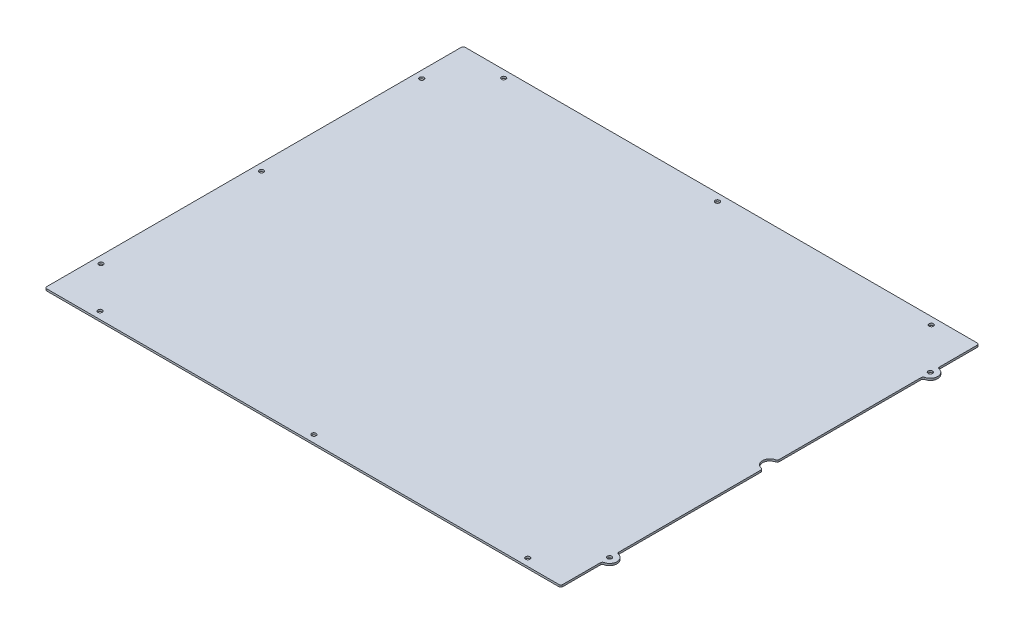
ISO-10303-21;
HEADER;
FILE_DESCRIPTION(('STEP AP214'),'2;1');
FILE_NAME('part.step','',(''),(''),'','','');
FILE_SCHEMA(('AUTOMOTIVE_DESIGN { 1 0 10303 214 1 1 1 1 }'));
ENDSEC;
DATA;
#1=APPLICATION_CONTEXT('core data for automotive mechanical design processes');
#2=APPLICATION_PROTOCOL_DEFINITION('international standard','automotive_design',2000,#1);
#3=PRODUCT_CONTEXT('',#1,'mechanical');
#4=PRODUCT('Part','Part','',(#3));
#5=PRODUCT_RELATED_PRODUCT_CATEGORY('part','',(#4));
#6=PRODUCT_DEFINITION_FORMATION('','',#4);
#7=PRODUCT_DEFINITION_CONTEXT('part definition',#1,'design');
#8=PRODUCT_DEFINITION('design','',#6,#7);
#9=PRODUCT_DEFINITION_SHAPE('','',#8);
#10=(LENGTH_UNIT() NAMED_UNIT(*) SI_UNIT(.MILLI.,.METRE.));
#11=(NAMED_UNIT(*) PLANE_ANGLE_UNIT() SI_UNIT($,.RADIAN.));
#12=(NAMED_UNIT(*) SI_UNIT($,.STERADIAN.) SOLID_ANGLE_UNIT());
#13=UNCERTAINTY_MEASURE_WITH_UNIT(LENGTH_MEASURE(1.E-05),#10,'distance_accuracy_value','');
#14=(GEOMETRIC_REPRESENTATION_CONTEXT(3) GLOBAL_UNCERTAINTY_ASSIGNED_CONTEXT((#13)) GLOBAL_UNIT_ASSIGNED_CONTEXT((#10,
#11,#12)) REPRESENTATION_CONTEXT('',''));
#15=CARTESIAN_POINT('',(0.,0.,0.));
#16=DIRECTION('',(0.,0.,1.));
#17=DIRECTION('',(1.,0.,0.));
#18=AXIS2_PLACEMENT_3D('',#15,#16,#17);
#19=CARTESIAN_POINT('',(-341.884,2.54,273.304));
#20=DIRECTION('',(1.,0.,0.));
#21=DIRECTION('',(0.,0.,-1.));
#22=AXIS2_PLACEMENT_3D('',#19,#20,#21);
#23=PLANE('',#22);
#24=DIRECTION('',(0.,0.,1.));
#25=VECTOR('',#24,1.);
#26=CARTESIAN_POINT('',(-341.884,2.54,273.304));
#27=LINE('',#26,#25);
#28=CARTESIAN_POINT('',(-341.884,2.54,-270.764));
#29=VERTEX_POINT('',#28);
#30=CARTESIAN_POINT('',(-341.884,2.54,270.764));
#31=VERTEX_POINT('',#30);
#32=EDGE_CURVE('E189',#29,#31,#27,.T.);
#33=ORIENTED_EDGE('',*,*,#32,.F.);
#34=DIRECTION('',(0.,-1.,0.));
#35=VECTOR('',#34,1.);
#36=CARTESIAN_POINT('',(-341.884,2.54,-270.764));
#37=LINE('',#36,#35);
#38=CARTESIAN_POINT('',(-341.884,0.,-270.764));
#39=VERTEX_POINT('',#38);
#40=EDGE_CURVE('E174',#29,#39,#37,.T.);
#41=ORIENTED_EDGE('',*,*,#40,.T.);
#42=DIRECTION('',(0.,0.,1.));
#43=VECTOR('',#42,1.);
#44=CARTESIAN_POINT('',(-341.884,0.,273.304));
#45=LINE('',#44,#43);
#46=CARTESIAN_POINT('',(-341.884,0.,270.764));
#47=VERTEX_POINT('',#46);
#48=EDGE_CURVE('E186',#39,#47,#45,.T.);
#49=ORIENTED_EDGE('',*,*,#48,.T.);
#50=DIRECTION('',(0.,-1.,0.));
#51=VECTOR('',#50,1.);
#52=CARTESIAN_POINT('',(-341.884,2.54,270.764));
#53=LINE('',#52,#51);
#54=EDGE_CURVE('E191',#47,#31,#53,.F.);
#55=ORIENTED_EDGE('',*,*,#54,.T.);
#56=EDGE_LOOP('',(#33,#41,#49,#55));
#57=FACE_BOUND('',#56,.T.);
#58=ADVANCED_FACE('F33',(#57),#23,.F.);
#59=CARTESIAN_POINT('',(-341.884,2.54,273.304));
#60=DIRECTION('',(0.,0.,-1.));
#61=DIRECTION('',(-1.,0.,0.));
#62=AXIS2_PLACEMENT_3D('',#59,#60,#61);
#63=PLANE('',#62);
#64=DIRECTION('',(1.,0.,0.));
#65=VECTOR('',#64,1.);
#66=CARTESIAN_POINT('',(-341.884,2.54,273.304));
#67=LINE('',#66,#65);
#68=CARTESIAN_POINT('',(-339.344,2.54,273.304));
#69=VERTEX_POINT('',#68);
#70=CARTESIAN_POINT('',(329.692,2.54,273.304));
#71=VERTEX_POINT('',#70);
#72=EDGE_CURVE('E335',#69,#71,#67,.T.);
#73=ORIENTED_EDGE('',*,*,#72,.F.);
#74=DIRECTION('',(0.,-1.,0.));
#75=VECTOR('',#74,1.);
#76=CARTESIAN_POINT('',(-339.344,2.54,273.304));
#77=LINE('',#76,#75);
#78=CARTESIAN_POINT('',(-339.344,0.,273.304));
#79=VERTEX_POINT('',#78);
#80=EDGE_CURVE('E255',#69,#79,#77,.T.);
#81=ORIENTED_EDGE('',*,*,#80,.T.);
#82=DIRECTION('',(1.,0.,0.));
#83=VECTOR('',#82,1.);
#84=CARTESIAN_POINT('',(-341.884,0.,273.304));
#85=LINE('',#84,#83);
#86=CARTESIAN_POINT('',(329.692,0.,273.304));
#87=VERTEX_POINT('',#86);
#88=EDGE_CURVE('E195',#79,#87,#85,.T.);
#89=ORIENTED_EDGE('',*,*,#88,.T.);
#90=DIRECTION('',(0.,-1.,0.));
#91=VECTOR('',#90,1.);
#92=CARTESIAN_POINT('',(329.692,2.54,273.304));
#93=LINE('',#92,#91);
#94=EDGE_CURVE('E253',#87,#71,#93,.F.);
#95=ORIENTED_EDGE('',*,*,#94,.T.);
#96=EDGE_LOOP('',(#73,#81,#89,#95));
#97=FACE_BOUND('',#96,.T.);
#98=ADVANCED_FACE('F454',(#97),#63,.F.);
#99=CARTESIAN_POINT('',(332.232,2.54,219.202));
#100=DIRECTION('',(-1.,0.,0.));
#101=DIRECTION('',(0.,0.,1.));
#102=AXIS2_PLACEMENT_3D('',#99,#100,#101);
#103=PLANE('',#102);
#104=DIRECTION('',(0.,0.,-1.));
#105=VECTOR('',#104,1.);
#106=CARTESIAN_POINT('',(332.232,2.54,219.202));
#107=LINE('',#106,#105);
#108=CARTESIAN_POINT('',(332.232,2.54,270.764));
#109=VERTEX_POINT('',#108);
#110=CARTESIAN_POINT('',(332.232,2.54,221.474481707814));
#111=VERTEX_POINT('',#110);
#112=EDGE_CURVE('E332',#109,#111,#107,.T.);
#113=ORIENTED_EDGE('',*,*,#112,.F.);
#114=DIRECTION('',(0.,-1.,0.));
#115=VECTOR('',#114,1.);
#116=CARTESIAN_POINT('',(332.232,2.54,270.764));
#117=LINE('',#116,#115);
#118=CARTESIAN_POINT('',(332.232,0.,270.764));
#119=VERTEX_POINT('',#118);
#120=EDGE_CURVE('E260',#109,#119,#117,.T.);
#121=ORIENTED_EDGE('',*,*,#120,.T.);
#122=DIRECTION('',(0.,0.,-1.));
#123=VECTOR('',#122,1.);
#124=CARTESIAN_POINT('',(332.232,0.,219.202));
#125=LINE('',#124,#123);
#126=CARTESIAN_POINT('',(332.232,0.,221.474481707814));
#127=VERTEX_POINT('',#126);
#128=EDGE_CURVE('E199',#119,#127,#125,.T.);
#129=ORIENTED_EDGE('',*,*,#128,.T.);
#130=DIRECTION('',(0.,1.,0.));
#131=VECTOR('',#130,1.);
#132=CARTESIAN_POINT('',(332.232,2.54,221.474481707814));
#133=LINE('',#132,#131);
#134=EDGE_CURVE('E258',#127,#111,#133,.T.);
#135=ORIENTED_EDGE('',*,*,#134,.T.);
#136=EDGE_LOOP('',(#113,#121,#129,#135));
#137=FACE_BOUND('',#136,.T.);
#138=ADVANCED_FACE('F459',(#137),#103,.F.);
#139=CARTESIAN_POINT('',(332.232,2.54,209.55));
#140=DIRECTION('',(0.,-1.,0.));
#141=DIRECTION('',(0.,0.,-1.));
#142=AXIS2_PLACEMENT_3D('',#139,#140,#141);
#143=CYLINDRICAL_SURFACE('',#142,9.65199999999997);
#144=CARTESIAN_POINT('',(332.232,2.54,209.55));
#145=DIRECTION('',(0.,1.,0.));
#146=DIRECTION('',(0.,0.,1.));
#147=AXIS2_PLACEMENT_3D('',#144,#145,#146);
#148=CIRCLE('',#147,9.65199999999997);
#149=CARTESIAN_POINT('',(334.242833333333,2.54,218.990214685353));
#150=VERTEX_POINT('',#149);
#151=CARTESIAN_POINT('',(334.242833333333,2.54,200.109785314647));
#152=VERTEX_POINT('',#151);
#153=EDGE_CURVE('E329',#150,#152,#148,.T.);
#154=ORIENTED_EDGE('',*,*,#153,.F.);
#155=DIRECTION('',(0.,-1.,0.));
#156=VECTOR('',#155,1.);
#157=CARTESIAN_POINT('',(334.242833333333,2.54,218.990214685353));
#158=LINE('',#157,#156);
#159=CARTESIAN_POINT('',(334.242833333333,0.,218.990214685353));
#160=VERTEX_POINT('',#159);
#161=EDGE_CURVE('E265',#150,#160,#158,.T.);
#162=ORIENTED_EDGE('',*,*,#161,.T.);
#163=CARTESIAN_POINT('',(332.232,0.,209.55));
#164=DIRECTION('',(0.,1.,0.));
#165=DIRECTION('',(0.,0.,1.));
#166=AXIS2_PLACEMENT_3D('',#163,#164,#165);
#167=CIRCLE('',#166,9.65199999999997);
#168=CARTESIAN_POINT('',(334.242833333333,0.,200.109785314647));
#169=VERTEX_POINT('',#168);
#170=EDGE_CURVE('E210',#160,#169,#167,.T.);
#171=ORIENTED_EDGE('',*,*,#170,.T.);
#172=DIRECTION('',(0.,-1.,0.));
#173=VECTOR('',#172,1.);
#174=CARTESIAN_POINT('',(334.242833333333,2.54,200.109785314647));
#175=LINE('',#174,#173);
#176=EDGE_CURVE('E263',#169,#152,#175,.F.);
#177=ORIENTED_EDGE('',*,*,#176,.T.);
#178=EDGE_LOOP('',(#154,#162,#171,#177));
#179=FACE_BOUND('',#178,.T.);
#180=ADVANCED_FACE('F520',(#179),#143,.T.);
#181=CARTESIAN_POINT('',(332.232,2.54,9.65199999999998));
#182=DIRECTION('',(-1.,0.,0.));
#183=DIRECTION('',(0.,0.,1.));
#184=AXIS2_PLACEMENT_3D('',#181,#182,#183);
#185=PLANE('',#184);
#186=DIRECTION('',(0.,0.,-1.));
#187=VECTOR('',#186,1.);
#188=CARTESIAN_POINT('',(332.232,2.54,9.65199999999998));
#189=LINE('',#188,#187);
#190=CARTESIAN_POINT('',(332.232,2.54,197.625518292186));
#191=VERTEX_POINT('',#190);
#192=CARTESIAN_POINT('',(332.232,2.54,11.9244817078144));
#193=VERTEX_POINT('',#192);
#194=EDGE_CURVE('E326',#191,#193,#189,.T.);
#195=ORIENTED_EDGE('',*,*,#194,.F.);
#196=DIRECTION('',(0.,1.,0.));
#197=VECTOR('',#196,1.);
#198=CARTESIAN_POINT('',(332.232,0.,197.625518292186));
#199=LINE('',#198,#197);
#200=CARTESIAN_POINT('',(332.232,0.,197.625518292186));
#201=VERTEX_POINT('',#200);
#202=EDGE_CURVE('E270',#191,#201,#199,.F.);
#203=ORIENTED_EDGE('',*,*,#202,.T.);
#204=DIRECTION('',(0.,0.,-1.));
#205=VECTOR('',#204,1.);
#206=CARTESIAN_POINT('',(332.232,0.,9.65199999999998));
#207=LINE('',#206,#205);
#208=CARTESIAN_POINT('',(332.232,0.,11.9244817078144));
#209=VERTEX_POINT('',#208);
#210=EDGE_CURVE('E213',#201,#209,#207,.T.);
#211=ORIENTED_EDGE('',*,*,#210,.T.);
#212=DIRECTION('',(0.,-1.,0.));
#213=VECTOR('',#212,1.);
#214=CARTESIAN_POINT('',(332.232,2.54,11.9244817078144));
#215=LINE('',#214,#213);
#216=EDGE_CURVE('E268',#209,#193,#215,.F.);
#217=ORIENTED_EDGE('',*,*,#216,.T.);
#218=EDGE_LOOP('',(#195,#203,#211,#217));
#219=FACE_BOUND('',#218,.T.);
#220=ADVANCED_FACE('F513',(#219),#185,.F.);
#221=CARTESIAN_POINT('',(332.232,2.54,0.));
#222=DIRECTION('',(0.,-1.,0.));
#223=DIRECTION('',(0.,0.,-1.));
#224=AXIS2_PLACEMENT_3D('',#221,#222,#223);
#225=CYLINDRICAL_SURFACE('',#224,9.65199999999998);
#226=CARTESIAN_POINT('',(332.232,2.54,0.));
#227=DIRECTION('',(0.,-1.,0.));
#228=DIRECTION('',(0.,0.,1.));
#229=AXIS2_PLACEMENT_3D('',#226,#227,#228);
#230=CIRCLE('',#229,9.65199999999998);
#231=CARTESIAN_POINT('',(330.221166666667,2.54,9.44021468535305));
#232=VERTEX_POINT('',#231);
#233=CARTESIAN_POINT('',(330.221166666667,2.54,-9.44021468535305));
#234=VERTEX_POINT('',#233);
#235=EDGE_CURVE('E323',#232,#234,#230,.T.);
#236=ORIENTED_EDGE('',*,*,#235,.F.);
#237=DIRECTION('',(0.,-1.,0.));
#238=VECTOR('',#237,1.);
#239=CARTESIAN_POINT('',(330.221166666667,2.54,9.44021468535305));
#240=LINE('',#239,#238);
#241=CARTESIAN_POINT('',(330.221166666667,0.,9.44021468535305));
#242=VERTEX_POINT('',#241);
#243=EDGE_CURVE('E275',#232,#242,#240,.T.);
#244=ORIENTED_EDGE('',*,*,#243,.T.);
#245=CARTESIAN_POINT('',(332.232,0.,0.));
#246=DIRECTION('',(0.,-1.,0.));
#247=DIRECTION('',(0.,0.,1.));
#248=AXIS2_PLACEMENT_3D('',#245,#246,#247);
#249=CIRCLE('',#248,9.65199999999998);
#250=CARTESIAN_POINT('',(330.221166666667,0.,-9.44021468535305));
#251=VERTEX_POINT('',#250);
#252=EDGE_CURVE('E216',#242,#251,#249,.T.);
#253=ORIENTED_EDGE('',*,*,#252,.T.);
#254=DIRECTION('',(0.,-1.,0.));
#255=VECTOR('',#254,1.);
#256=CARTESIAN_POINT('',(330.221166666667,2.54,-9.44021468535305));
#257=LINE('',#256,#255);
#258=EDGE_CURVE('E273',#251,#234,#257,.F.);
#259=ORIENTED_EDGE('',*,*,#258,.T.);
#260=EDGE_LOOP('',(#236,#244,#253,#259));
#261=FACE_BOUND('',#260,.T.);
#262=ADVANCED_FACE('F506',(#261),#225,.F.);
#263=CARTESIAN_POINT('',(332.232,2.54,-199.898));
#264=DIRECTION('',(-1.,0.,0.));
#265=DIRECTION('',(0.,0.,1.));
#266=AXIS2_PLACEMENT_3D('',#263,#264,#265);
#267=PLANE('',#266);
#268=DIRECTION('',(0.,0.,-1.));
#269=VECTOR('',#268,1.);
#270=CARTESIAN_POINT('',(332.232,2.54,-199.898));
#271=LINE('',#270,#269);
#272=CARTESIAN_POINT('',(332.232,2.54,-11.9244817078144));
#273=VERTEX_POINT('',#272);
#274=CARTESIAN_POINT('',(332.232,2.54,-197.625518292186));
#275=VERTEX_POINT('',#274);
#276=EDGE_CURVE('E318',#273,#275,#271,.T.);
#277=ORIENTED_EDGE('',*,*,#276,.F.);
#278=DIRECTION('',(0.,-1.,0.));
#279=VECTOR('',#278,1.);
#280=CARTESIAN_POINT('',(332.232,2.54,-11.9244817078144));
#281=LINE('',#280,#279);
#282=CARTESIAN_POINT('',(332.232,0.,-11.9244817078144));
#283=VERTEX_POINT('',#282);
#284=EDGE_CURVE('E280',#273,#283,#281,.T.);
#285=ORIENTED_EDGE('',*,*,#284,.T.);
#286=DIRECTION('',(0.,0.,-1.));
#287=VECTOR('',#286,1.);
#288=CARTESIAN_POINT('',(332.232,0.,-199.898));
#289=LINE('',#288,#287);
#290=CARTESIAN_POINT('',(332.232,0.,-197.625518292186));
#291=VERTEX_POINT('',#290);
#292=EDGE_CURVE('E219',#283,#291,#289,.T.);
#293=ORIENTED_EDGE('',*,*,#292,.T.);
#294=DIRECTION('',(0.,1.,0.));
#295=VECTOR('',#294,1.);
#296=CARTESIAN_POINT('',(332.232,2.54,-197.625518292186));
#297=LINE('',#296,#295);
#298=EDGE_CURVE('E278',#291,#275,#297,.T.);
#299=ORIENTED_EDGE('',*,*,#298,.T.);
#300=EDGE_LOOP('',(#277,#285,#293,#299));
#301=FACE_BOUND('',#300,.T.);
#302=ADVANCED_FACE('F500',(#301),#267,.F.);
#303=CARTESIAN_POINT('',(332.232,2.54,-209.55));
#304=DIRECTION('',(0.,-1.,0.));
#305=DIRECTION('',(0.,0.,-1.));
#306=AXIS2_PLACEMENT_3D('',#303,#304,#305);
#307=CYLINDRICAL_SURFACE('',#306,9.65199999999997);
#308=CARTESIAN_POINT('',(332.232,2.54,-209.55));
#309=DIRECTION('',(0.,1.,0.));
#310=DIRECTION('',(0.,0.,1.));
#311=AXIS2_PLACEMENT_3D('',#308,#309,#310);
#312=CIRCLE('',#311,9.65199999999997);
#313=CARTESIAN_POINT('',(334.242833333333,2.54,-200.109785314647));
#314=VERTEX_POINT('',#313);
#315=CARTESIAN_POINT('',(334.242833333333,2.54,-218.990214685353));
#316=VERTEX_POINT('',#315);
#317=EDGE_CURVE('E316',#314,#316,#312,.T.);
#318=ORIENTED_EDGE('',*,*,#317,.F.);
#319=DIRECTION('',(0.,-1.,0.));
#320=VECTOR('',#319,1.);
#321=CARTESIAN_POINT('',(334.242833333333,2.54,-200.109785314647));
#322=LINE('',#321,#320);
#323=CARTESIAN_POINT('',(334.242833333333,0.,-200.109785314647));
#324=VERTEX_POINT('',#323);
#325=EDGE_CURVE('E285',#314,#324,#322,.T.);
#326=ORIENTED_EDGE('',*,*,#325,.T.);
#327=CARTESIAN_POINT('',(332.232,0.,-209.55));
#328=DIRECTION('',(0.,1.,0.));
#329=DIRECTION('',(0.,0.,1.));
#330=AXIS2_PLACEMENT_3D('',#327,#328,#329);
#331=CIRCLE('',#330,9.65199999999997);
#332=CARTESIAN_POINT('',(334.242833333333,0.,-218.990214685353));
#333=VERTEX_POINT('',#332);
#334=EDGE_CURVE('E222',#324,#333,#331,.T.);
#335=ORIENTED_EDGE('',*,*,#334,.T.);
#336=DIRECTION('',(0.,-1.,0.));
#337=VECTOR('',#336,1.);
#338=CARTESIAN_POINT('',(334.242833333333,2.54,-218.990214685353));
#339=LINE('',#338,#337);
#340=EDGE_CURVE('E283',#333,#316,#339,.F.);
#341=ORIENTED_EDGE('',*,*,#340,.T.);
#342=EDGE_LOOP('',(#318,#326,#335,#341));
#343=FACE_BOUND('',#342,.T.);
#344=ADVANCED_FACE('F310',(#343),#307,.T.);
#345=CARTESIAN_POINT('',(332.232,2.54,-273.304));
#346=DIRECTION('',(-1.,0.,0.));
#347=DIRECTION('',(0.,0.,1.));
#348=AXIS2_PLACEMENT_3D('',#345,#346,#347);
#349=PLANE('',#348);
#350=DIRECTION('',(0.,0.,-1.));
#351=VECTOR('',#350,1.);
#352=CARTESIAN_POINT('',(332.232,2.54,-273.304));
#353=LINE('',#352,#351);
#354=CARTESIAN_POINT('',(332.232,2.54,-221.474481707814));
#355=VERTEX_POINT('',#354);
#356=CARTESIAN_POINT('',(332.232,2.54,-270.764));
#357=VERTEX_POINT('',#356);
#358=EDGE_CURVE('E314',#355,#357,#353,.T.);
#359=ORIENTED_EDGE('',*,*,#358,.F.);
#360=DIRECTION('',(0.,1.,0.));
#361=VECTOR('',#360,1.);
#362=CARTESIAN_POINT('',(332.232,0.,-221.474481707814));
#363=LINE('',#362,#361);
#364=CARTESIAN_POINT('',(332.232,0.,-221.474481707814));
#365=VERTEX_POINT('',#364);
#366=EDGE_CURVE('E289',#355,#365,#363,.F.);
#367=ORIENTED_EDGE('',*,*,#366,.T.);
#368=DIRECTION('',(0.,0.,-1.));
#369=VECTOR('',#368,1.);
#370=CARTESIAN_POINT('',(332.232,0.,-273.304));
#371=LINE('',#370,#369);
#372=CARTESIAN_POINT('',(332.232,0.,-270.764));
#373=VERTEX_POINT('',#372);
#374=EDGE_CURVE('E225',#365,#373,#371,.T.);
#375=ORIENTED_EDGE('',*,*,#374,.T.);
#376=DIRECTION('',(0.,-1.,0.));
#377=VECTOR('',#376,1.);
#378=CARTESIAN_POINT('',(332.232,2.54,-270.764));
#379=LINE('',#378,#377);
#380=EDGE_CURVE('E48',#373,#357,#379,.F.);
#381=ORIENTED_EDGE('',*,*,#380,.T.);
#382=EDGE_LOOP('',(#359,#367,#375,#381));
#383=FACE_BOUND('',#382,.T.);
#384=ADVANCED_FACE('F313',(#383),#349,.F.);
#385=CARTESIAN_POINT('',(-341.884,2.54,-273.304));
#386=DIRECTION('',(0.,0.,1.));
#387=DIRECTION('',(1.,0.,0.));
#388=AXIS2_PLACEMENT_3D('',#385,#386,#387);
#389=PLANE('',#388);
#390=DIRECTION('',(-1.,0.,0.));
#391=VECTOR('',#390,1.);
#392=CARTESIAN_POINT('',(-341.884,0.,-273.304));
#393=LINE('',#392,#391);
#394=CARTESIAN_POINT('',(329.692,0.,-273.304));
#395=VERTEX_POINT('',#394);
#396=CARTESIAN_POINT('',(-339.344,0.,-273.304));
#397=VERTEX_POINT('',#396);
#398=EDGE_CURVE('E227',#395,#397,#393,.T.);
#399=ORIENTED_EDGE('',*,*,#398,.T.);
#400=DIRECTION('',(0.,-1.,0.));
#401=VECTOR('',#400,1.);
#402=CARTESIAN_POINT('',(-339.344,2.54,-273.304));
#403=LINE('',#402,#401);
#404=CARTESIAN_POINT('',(-339.344,2.54,-273.304));
#405=VERTEX_POINT('',#404);
#406=EDGE_CURVE('E175',#397,#405,#403,.F.);
#407=ORIENTED_EDGE('',*,*,#406,.T.);
#408=DIRECTION('',(-1.,0.,0.));
#409=VECTOR('',#408,1.);
#410=CARTESIAN_POINT('',(-341.884,2.54,-273.304));
#411=LINE('',#410,#409);
#412=CARTESIAN_POINT('',(329.692,2.54,-273.304));
#413=VERTEX_POINT('',#412);
#414=EDGE_CURVE('E205',#413,#405,#411,.T.);
#415=ORIENTED_EDGE('',*,*,#414,.F.);
#416=DIRECTION('',(0.,-1.,0.));
#417=VECTOR('',#416,1.);
#418=CARTESIAN_POINT('',(329.692,2.54,-273.304));
#419=LINE('',#418,#417);
#420=EDGE_CURVE('E180',#413,#395,#419,.T.);
#421=ORIENTED_EDGE('',*,*,#420,.T.);
#422=EDGE_LOOP('',(#399,#407,#415,#421));
#423=FACE_BOUND('',#422,.T.);
#424=ADVANCED_FACE('F436',(#423),#389,.F.);
#425=CARTESIAN_POINT('',(332.232,2.54,-209.55));
#426=DIRECTION('',(0.,1.,0.));
#427=DIRECTION('',(0.,0.,1.));
#428=AXIS2_PLACEMENT_3D('',#425,#426,#427);
#429=PLANE('',#428);
#430=CARTESIAN_POINT('',(279.4,2.54,-263.652));
#431=DIRECTION('',(0.,-1.,0.));
#432=DIRECTION('',(0.,0.,-1.));
#433=AXIS2_PLACEMENT_3D('',#430,#431,#432);
#434=CIRCLE('',#433,2.8956);
#435=CARTESIAN_POINT('',(279.4,2.54,-266.5476));
#436=VERTEX_POINT('',#435);
#437=EDGE_CURVE('E395',#436,#436,#434,.T.);
#438=ORIENTED_EDGE('',*,*,#437,.T.);
#439=EDGE_LOOP('',(#438));
#440=FACE_BOUND('',#439,.T.);
#441=CARTESIAN_POINT('',(1.11022302462516E-13,2.54,-263.652));
#442=DIRECTION('',(0.,-1.,0.));
#443=DIRECTION('',(0.,0.,-1.));
#444=AXIS2_PLACEMENT_3D('',#441,#442,#443);
#445=CIRCLE('',#444,2.8956);
#446=CARTESIAN_POINT('',(1.11022302462516E-13,2.54,-266.5476));
#447=VERTEX_POINT('',#446);
#448=EDGE_CURVE('E389',#447,#447,#445,.T.);
#449=ORIENTED_EDGE('',*,*,#448,.T.);
#450=EDGE_LOOP('',(#449));
#451=FACE_BOUND('',#450,.T.);
#452=CARTESIAN_POINT('',(-279.4,2.54,-263.652));
#453=DIRECTION('',(0.,-1.,0.));
#454=DIRECTION('',(0.,0.,-1.));
#455=AXIS2_PLACEMENT_3D('',#452,#453,#454);
#456=CIRCLE('',#455,2.8956);
#457=CARTESIAN_POINT('',(-279.4,2.54,-266.5476));
#458=VERTEX_POINT('',#457);
#459=EDGE_CURVE('E383',#458,#458,#456,.T.);
#460=ORIENTED_EDGE('',*,*,#459,.T.);
#461=EDGE_LOOP('',(#460));
#462=FACE_BOUND('',#461,.T.);
#463=CARTESIAN_POINT('',(-332.232,2.54,-209.55));
#464=DIRECTION('',(0.,-1.,0.));
#465=DIRECTION('',(0.,0.,-1.));
#466=AXIS2_PLACEMENT_3D('',#463,#464,#465);
#467=CIRCLE('',#466,2.8956);
#468=CARTESIAN_POINT('',(-332.232,2.54,-212.4456));
#469=VERTEX_POINT('',#468);
#470=EDGE_CURVE('E377',#469,#469,#467,.T.);
#471=ORIENTED_EDGE('',*,*,#470,.T.);
#472=EDGE_LOOP('',(#471));
#473=FACE_BOUND('',#472,.T.);
#474=CARTESIAN_POINT('',(-332.232,2.54,1.11022302462516E-13));
#475=DIRECTION('',(0.,-1.,0.));
#476=DIRECTION('',(0.,0.,-1.));
#477=AXIS2_PLACEMENT_3D('',#474,#475,#476);
#478=CIRCLE('',#477,2.8956);
#479=CARTESIAN_POINT('',(-332.232,2.54,-2.89559999999989));
#480=VERTEX_POINT('',#479);
#481=EDGE_CURVE('E371',#480,#480,#478,.T.);
#482=ORIENTED_EDGE('',*,*,#481,.T.);
#483=EDGE_LOOP('',(#482));
#484=FACE_BOUND('',#483,.T.);
#485=CARTESIAN_POINT('',(-332.232,2.54,209.55));
#486=DIRECTION('',(0.,-1.,0.));
#487=DIRECTION('',(0.,0.,-1.));
#488=AXIS2_PLACEMENT_3D('',#485,#486,#487);
#489=CIRCLE('',#488,2.8956);
#490=CARTESIAN_POINT('',(-332.232,2.54,206.6544));
#491=VERTEX_POINT('',#490);
#492=EDGE_CURVE('E365',#491,#491,#489,.T.);
#493=ORIENTED_EDGE('',*,*,#492,.T.);
#494=EDGE_LOOP('',(#493));
#495=FACE_BOUND('',#494,.T.);
#496=CARTESIAN_POINT('',(-279.4,2.54,263.652));
#497=DIRECTION('',(0.,-1.,0.));
#498=DIRECTION('',(0.,0.,-1.));
#499=AXIS2_PLACEMENT_3D('',#496,#497,#498);
#500=CIRCLE('',#499,2.8956);
#501=CARTESIAN_POINT('',(-279.4,2.54,260.7564));
#502=VERTEX_POINT('',#501);
#503=EDGE_CURVE('E359',#502,#502,#500,.T.);
#504=ORIENTED_EDGE('',*,*,#503,.T.);
#505=EDGE_LOOP('',(#504));
#506=FACE_BOUND('',#505,.T.);
#507=CARTESIAN_POINT('',(1.11022302462516E-13,2.54,263.652));
#508=DIRECTION('',(0.,-1.,0.));
#509=DIRECTION('',(0.,0.,-1.));
#510=AXIS2_PLACEMENT_3D('',#507,#508,#509);
#511=CIRCLE('',#510,2.8956);
#512=CARTESIAN_POINT('',(1.11022302462516E-13,2.54,260.7564));
#513=VERTEX_POINT('',#512);
#514=EDGE_CURVE('E353',#513,#513,#511,.T.);
#515=ORIENTED_EDGE('',*,*,#514,.T.);
#516=EDGE_LOOP('',(#515));
#517=FACE_BOUND('',#516,.T.);
#518=CARTESIAN_POINT('',(279.4,2.54,263.652));
#519=DIRECTION('',(0.,-1.,0.));
#520=DIRECTION('',(0.,0.,-1.));
#521=AXIS2_PLACEMENT_3D('',#518,#519,#520);
#522=CIRCLE('',#521,2.8956);
#523=CARTESIAN_POINT('',(279.4,2.54,260.7564));
#524=VERTEX_POINT('',#523);
#525=EDGE_CURVE('E347',#524,#524,#522,.T.);
#526=ORIENTED_EDGE('',*,*,#525,.T.);
#527=EDGE_LOOP('',(#526));
#528=FACE_BOUND('',#527,.T.);
#529=CARTESIAN_POINT('',(332.232,2.54,-209.55));
#530=DIRECTION('',(0.,1.,0.));
#531=DIRECTION('',(0.,0.,1.));
#532=AXIS2_PLACEMENT_3D('',#529,#530,#531);
#533=CIRCLE('',#532,2.8956);
#534=CARTESIAN_POINT('',(332.232,2.54,-206.6544));
#535=VERTEX_POINT('',#534);
#536=EDGE_CURVE('E344',#535,#535,#533,.T.);
#537=ORIENTED_EDGE('',*,*,#536,.F.);
#538=EDGE_LOOP('',(#537));
#539=FACE_BOUND('',#538,.T.);
#540=CARTESIAN_POINT('',(332.232,2.54,209.55));
#541=DIRECTION('',(0.,1.,0.));
#542=DIRECTION('',(0.,0.,1.));
#543=AXIS2_PLACEMENT_3D('',#540,#541,#542);
#544=CIRCLE('',#543,2.8956);
#545=CARTESIAN_POINT('',(332.232,2.54,212.4456));
#546=VERTEX_POINT('',#545);
#547=EDGE_CURVE('E202',#546,#546,#544,.T.);
#548=ORIENTED_EDGE('',*,*,#547,.F.);
#549=EDGE_LOOP('',(#548));
#550=FACE_BOUND('',#549,.T.);
#551=ORIENTED_EDGE('',*,*,#414,.T.);
#552=CARTESIAN_POINT('',(-339.344,2.54,-270.764));
#553=DIRECTION('',(0.,1.,0.));
#554=DIRECTION('',(0.,0.,1.));
#555=AXIS2_PLACEMENT_3D('',#552,#553,#554);
#556=CIRCLE('',#555,2.54);
#557=EDGE_CURVE('E251',#405,#29,#556,.T.);
#558=ORIENTED_EDGE('',*,*,#557,.T.);
#559=ORIENTED_EDGE('',*,*,#32,.T.);
#560=CARTESIAN_POINT('',(-339.344,2.54,270.764));
#561=DIRECTION('',(0.,1.,0.));
#562=DIRECTION('',(0.,0.,1.));
#563=AXIS2_PLACEMENT_3D('',#560,#561,#562);
#564=CIRCLE('',#563,2.54);
#565=EDGE_CURVE('E249',#31,#69,#564,.T.);
#566=ORIENTED_EDGE('',*,*,#565,.T.);
#567=ORIENTED_EDGE('',*,*,#72,.T.);
#568=CARTESIAN_POINT('',(329.692,2.54,270.764));
#569=DIRECTION('',(0.,1.,0.));
#570=DIRECTION('',(0.,0.,1.));
#571=AXIS2_PLACEMENT_3D('',#568,#569,#570);
#572=CIRCLE('',#571,2.54);
#573=EDGE_CURVE('E247',#71,#109,#572,.T.);
#574=ORIENTED_EDGE('',*,*,#573,.T.);
#575=ORIENTED_EDGE('',*,*,#112,.T.);
#576=CARTESIAN_POINT('',(334.772,2.54,221.474481707814));
#577=DIRECTION('',(0.,1.,0.));
#578=DIRECTION('',(0.,0.,1.));
#579=AXIS2_PLACEMENT_3D('',#576,#577,#578);
#580=CIRCLE('',#579,2.54);
#581=EDGE_CURVE('E294',#111,#150,#580,.F.);
#582=ORIENTED_EDGE('',*,*,#581,.T.);
#583=ORIENTED_EDGE('',*,*,#153,.T.);
#584=CARTESIAN_POINT('',(334.772,2.54,197.625518292186));
#585=DIRECTION('',(0.,1.,0.));
#586=DIRECTION('',(0.,0.,1.));
#587=AXIS2_PLACEMENT_3D('',#584,#585,#586);
#588=CIRCLE('',#587,2.54);
#589=EDGE_CURVE('E298',#152,#191,#588,.F.);
#590=ORIENTED_EDGE('',*,*,#589,.T.);
#591=ORIENTED_EDGE('',*,*,#194,.T.);
#592=CARTESIAN_POINT('',(329.692,2.54,11.9244817078144));
#593=DIRECTION('',(0.,1.,0.));
#594=DIRECTION('',(0.,0.,1.));
#595=AXIS2_PLACEMENT_3D('',#592,#593,#594);
#596=CIRCLE('',#595,2.54);
#597=EDGE_CURVE('E245',#193,#232,#596,.T.);
#598=ORIENTED_EDGE('',*,*,#597,.T.);
#599=ORIENTED_EDGE('',*,*,#235,.T.);
#600=CARTESIAN_POINT('',(329.692,2.54,-11.9244817078144));
#601=DIRECTION('',(0.,1.,0.));
#602=DIRECTION('',(0.,0.,1.));
#603=AXIS2_PLACEMENT_3D('',#600,#601,#602);
#604=CIRCLE('',#603,2.54);
#605=EDGE_CURVE('E243',#234,#273,#604,.T.);
#606=ORIENTED_EDGE('',*,*,#605,.T.);
#607=ORIENTED_EDGE('',*,*,#276,.T.);
#608=CARTESIAN_POINT('',(334.772,2.54,-197.625518292186));
#609=DIRECTION('',(0.,1.,0.));
#610=DIRECTION('',(0.,0.,1.));
#611=AXIS2_PLACEMENT_3D('',#608,#609,#610);
#612=CIRCLE('',#611,2.54);
#613=EDGE_CURVE('E302',#275,#314,#612,.F.);
#614=ORIENTED_EDGE('',*,*,#613,.T.);
#615=ORIENTED_EDGE('',*,*,#317,.T.);
#616=CARTESIAN_POINT('',(334.772,2.54,-221.474481707814));
#617=DIRECTION('',(0.,1.,0.));
#618=DIRECTION('',(0.,0.,1.));
#619=AXIS2_PLACEMENT_3D('',#616,#617,#618);
#620=CIRCLE('',#619,2.54);
#621=EDGE_CURVE('E11',#316,#355,#620,.F.);
#622=ORIENTED_EDGE('',*,*,#621,.T.);
#623=ORIENTED_EDGE('',*,*,#358,.T.);
#624=CARTESIAN_POINT('',(329.692,2.54,-270.764));
#625=DIRECTION('',(0.,1.,0.));
#626=DIRECTION('',(0.,0.,1.));
#627=AXIS2_PLACEMENT_3D('',#624,#625,#626);
#628=CIRCLE('',#627,2.54);
#629=EDGE_CURVE('E241',#357,#413,#628,.T.);
#630=ORIENTED_EDGE('',*,*,#629,.T.);
#631=EDGE_LOOP('',(#551,#558,#559,#566,#567,#574,#575,#582,#583,#590,#591,#598,#599,#606,#607,
#614,#615,#622,#623,#630));
#632=FACE_BOUND('',#631,.T.);
#633=ADVANCED_FACE('F407',(#440,#451,#462,#473,#484,#495,#506,#517,#528,#539,#550,#632),#429,.T.);
#634=CARTESIAN_POINT('',(332.232,0.,-209.55));
#635=DIRECTION('',(0.,1.,0.));
#636=DIRECTION('',(0.,0.,1.));
#637=AXIS2_PLACEMENT_3D('',#634,#635,#636);
#638=PLANE('',#637);
#639=CARTESIAN_POINT('',(279.4,0.,-263.652));
#640=DIRECTION('',(0.,-1.,0.));
#641=DIRECTION('',(0.,0.,-1.));
#642=AXIS2_PLACEMENT_3D('',#639,#640,#641);
#643=CIRCLE('',#642,2.8956);
#644=CARTESIAN_POINT('',(279.4,0.,-266.5476));
#645=VERTEX_POINT('',#644);
#646=EDGE_CURVE('E398',#645,#645,#643,.T.);
#647=ORIENTED_EDGE('',*,*,#646,.F.);
#648=EDGE_LOOP('',(#647));
#649=FACE_BOUND('',#648,.T.);
#650=CARTESIAN_POINT('',(1.11022302462516E-13,0.,-263.652));
#651=DIRECTION('',(0.,-1.,0.));
#652=DIRECTION('',(0.,0.,-1.));
#653=AXIS2_PLACEMENT_3D('',#650,#651,#652);
#654=CIRCLE('',#653,2.89559999999999);
#655=CARTESIAN_POINT('',(1.11022302462516E-13,0.,-266.5476));
#656=VERTEX_POINT('',#655);
#657=EDGE_CURVE('E392',#656,#656,#654,.T.);
#658=ORIENTED_EDGE('',*,*,#657,.F.);
#659=EDGE_LOOP('',(#658));
#660=FACE_BOUND('',#659,.T.);
#661=CARTESIAN_POINT('',(-279.4,0.,-263.652));
#662=DIRECTION('',(0.,-1.,0.));
#663=DIRECTION('',(0.,0.,-1.));
#664=AXIS2_PLACEMENT_3D('',#661,#662,#663);
#665=CIRCLE('',#664,2.8956);
#666=CARTESIAN_POINT('',(-279.4,0.,-266.5476));
#667=VERTEX_POINT('',#666);
#668=EDGE_CURVE('E386',#667,#667,#665,.T.);
#669=ORIENTED_EDGE('',*,*,#668,.F.);
#670=EDGE_LOOP('',(#669));
#671=FACE_BOUND('',#670,.T.);
#672=CARTESIAN_POINT('',(-332.232,0.,-209.55));
#673=DIRECTION('',(0.,-1.,0.));
#674=DIRECTION('',(0.,0.,-1.));
#675=AXIS2_PLACEMENT_3D('',#672,#673,#674);
#676=CIRCLE('',#675,2.8956);
#677=CARTESIAN_POINT('',(-332.232,0.,-212.4456));
#678=VERTEX_POINT('',#677);
#679=EDGE_CURVE('E380',#678,#678,#676,.T.);
#680=ORIENTED_EDGE('',*,*,#679,.F.);
#681=EDGE_LOOP('',(#680));
#682=FACE_BOUND('',#681,.T.);
#683=CARTESIAN_POINT('',(-332.232,0.,1.11022302462516E-13));
#684=DIRECTION('',(0.,-1.,0.));
#685=DIRECTION('',(0.,0.,-1.));
#686=AXIS2_PLACEMENT_3D('',#683,#684,#685);
#687=CIRCLE('',#686,2.8956);
#688=CARTESIAN_POINT('',(-332.232,0.,-2.89559999999989));
#689=VERTEX_POINT('',#688);
#690=EDGE_CURVE('E374',#689,#689,#687,.T.);
#691=ORIENTED_EDGE('',*,*,#690,.F.);
#692=EDGE_LOOP('',(#691));
#693=FACE_BOUND('',#692,.T.);
#694=CARTESIAN_POINT('',(-332.232,0.,209.55));
#695=DIRECTION('',(0.,-1.,0.));
#696=DIRECTION('',(0.,0.,-1.));
#697=AXIS2_PLACEMENT_3D('',#694,#695,#696);
#698=CIRCLE('',#697,2.8956);
#699=CARTESIAN_POINT('',(-332.232,0.,206.6544));
#700=VERTEX_POINT('',#699);
#701=EDGE_CURVE('E368',#700,#700,#698,.T.);
#702=ORIENTED_EDGE('',*,*,#701,.F.);
#703=EDGE_LOOP('',(#702));
#704=FACE_BOUND('',#703,.T.);
#705=CARTESIAN_POINT('',(-279.4,0.,263.652));
#706=DIRECTION('',(0.,-1.,0.));
#707=DIRECTION('',(0.,0.,-1.));
#708=AXIS2_PLACEMENT_3D('',#705,#706,#707);
#709=CIRCLE('',#708,2.8956);
#710=CARTESIAN_POINT('',(-279.4,0.,260.7564));
#711=VERTEX_POINT('',#710);
#712=EDGE_CURVE('E362',#711,#711,#709,.T.);
#713=ORIENTED_EDGE('',*,*,#712,.F.);
#714=EDGE_LOOP('',(#713));
#715=FACE_BOUND('',#714,.T.);
#716=CARTESIAN_POINT('',(1.11022302462516E-13,0.,263.652));
#717=DIRECTION('',(0.,-1.,0.));
#718=DIRECTION('',(0.,0.,-1.));
#719=AXIS2_PLACEMENT_3D('',#716,#717,#718);
#720=CIRCLE('',#719,2.89559999999999);
#721=CARTESIAN_POINT('',(1.11022302462516E-13,0.,260.7564));
#722=VERTEX_POINT('',#721);
#723=EDGE_CURVE('E356',#722,#722,#720,.T.);
#724=ORIENTED_EDGE('',*,*,#723,.F.);
#725=EDGE_LOOP('',(#724));
#726=FACE_BOUND('',#725,.T.);
#727=CARTESIAN_POINT('',(279.4,0.,263.652));
#728=DIRECTION('',(0.,-1.,0.));
#729=DIRECTION('',(0.,0.,-1.));
#730=AXIS2_PLACEMENT_3D('',#727,#728,#729);
#731=CIRCLE('',#730,2.8956);
#732=CARTESIAN_POINT('',(279.4,0.,260.7564));
#733=VERTEX_POINT('',#732);
#734=EDGE_CURVE('E350',#733,#733,#731,.T.);
#735=ORIENTED_EDGE('',*,*,#734,.F.);
#736=EDGE_LOOP('',(#735));
#737=FACE_BOUND('',#736,.T.);
#738=CARTESIAN_POINT('',(332.232,0.,-209.55));
#739=DIRECTION('',(0.,1.,0.));
#740=DIRECTION('',(0.,0.,1.));
#741=AXIS2_PLACEMENT_3D('',#738,#739,#740);
#742=CIRCLE('',#741,2.8956);
#743=CARTESIAN_POINT('',(332.232,0.,-206.6544));
#744=VERTEX_POINT('',#743);
#745=EDGE_CURVE('E341',#744,#744,#742,.T.);
#746=ORIENTED_EDGE('',*,*,#745,.T.);
#747=EDGE_LOOP('',(#746));
#748=FACE_BOUND('',#747,.T.);
#749=CARTESIAN_POINT('',(332.232,0.,209.55));
#750=DIRECTION('',(0.,1.,0.));
#751=DIRECTION('',(0.,0.,1.));
#752=AXIS2_PLACEMENT_3D('',#749,#750,#751);
#753=CIRCLE('',#752,2.8956);
#754=CARTESIAN_POINT('',(332.232,0.,212.4456));
#755=VERTEX_POINT('',#754);
#756=EDGE_CURVE('E196',#755,#755,#753,.T.);
#757=ORIENTED_EDGE('',*,*,#756,.T.);
#758=EDGE_LOOP('',(#757));
#759=FACE_BOUND('',#758,.T.);
#760=ORIENTED_EDGE('',*,*,#48,.F.);
#761=CARTESIAN_POINT('',(-339.344,0.,-270.764));
#762=DIRECTION('',(0.,1.,0.));
#763=DIRECTION('',(0.,0.,1.));
#764=AXIS2_PLACEMENT_3D('',#761,#762,#763);
#765=CIRCLE('',#764,2.54);
#766=EDGE_CURVE('E170',#39,#397,#765,.F.);
#767=ORIENTED_EDGE('',*,*,#766,.T.);
#768=ORIENTED_EDGE('',*,*,#398,.F.);
#769=CARTESIAN_POINT('',(329.692,0.,-270.764));
#770=DIRECTION('',(0.,1.,0.));
#771=DIRECTION('',(0.,0.,1.));
#772=AXIS2_PLACEMENT_3D('',#769,#770,#771);
#773=CIRCLE('',#772,2.54);
#774=EDGE_CURVE('E190',#395,#373,#773,.F.);
#775=ORIENTED_EDGE('',*,*,#774,.T.);
#776=ORIENTED_EDGE('',*,*,#374,.F.);
#777=CARTESIAN_POINT('',(334.772,0.,-221.474481707814));
#778=DIRECTION('',(0.,1.,0.));
#779=DIRECTION('',(0.,0.,1.));
#780=AXIS2_PLACEMENT_3D('',#777,#778,#779);
#781=CIRCLE('',#780,2.54);
#782=EDGE_CURVE('E41',#365,#333,#781,.T.);
#783=ORIENTED_EDGE('',*,*,#782,.T.);
#784=ORIENTED_EDGE('',*,*,#334,.F.);
#785=CARTESIAN_POINT('',(334.772,0.,-197.625518292186));
#786=DIRECTION('',(0.,1.,0.));
#787=DIRECTION('',(0.,0.,1.));
#788=AXIS2_PLACEMENT_3D('',#785,#786,#787);
#789=CIRCLE('',#788,2.54);
#790=EDGE_CURVE('E300',#324,#291,#789,.T.);
#791=ORIENTED_EDGE('',*,*,#790,.T.);
#792=ORIENTED_EDGE('',*,*,#292,.F.);
#793=CARTESIAN_POINT('',(329.692,0.,-11.9244817078144));
#794=DIRECTION('',(0.,1.,0.));
#795=DIRECTION('',(0.,0.,1.));
#796=AXIS2_PLACEMENT_3D('',#793,#794,#795);
#797=CIRCLE('',#796,2.54);
#798=EDGE_CURVE('E231',#283,#251,#797,.F.);
#799=ORIENTED_EDGE('',*,*,#798,.T.);
#800=ORIENTED_EDGE('',*,*,#252,.F.);
#801=CARTESIAN_POINT('',(329.692,0.,11.9244817078144));
#802=DIRECTION('',(0.,1.,0.));
#803=DIRECTION('',(0.,0.,1.));
#804=AXIS2_PLACEMENT_3D('',#801,#802,#803);
#805=CIRCLE('',#804,2.54);
#806=EDGE_CURVE('E233',#242,#209,#805,.F.);
#807=ORIENTED_EDGE('',*,*,#806,.T.);
#808=ORIENTED_EDGE('',*,*,#210,.F.);
#809=CARTESIAN_POINT('',(334.772,0.,197.625518292186));
#810=DIRECTION('',(0.,1.,0.));
#811=DIRECTION('',(0.,0.,1.));
#812=AXIS2_PLACEMENT_3D('',#809,#810,#811);
#813=CIRCLE('',#812,2.54);
#814=EDGE_CURVE('E296',#201,#169,#813,.T.);
#815=ORIENTED_EDGE('',*,*,#814,.T.);
#816=ORIENTED_EDGE('',*,*,#170,.F.);
#817=CARTESIAN_POINT('',(334.772,0.,221.474481707814));
#818=DIRECTION('',(0.,1.,0.));
#819=DIRECTION('',(0.,0.,1.));
#820=AXIS2_PLACEMENT_3D('',#817,#818,#819);
#821=CIRCLE('',#820,2.54);
#822=EDGE_CURVE('E292',#160,#127,#821,.T.);
#823=ORIENTED_EDGE('',*,*,#822,.T.);
#824=ORIENTED_EDGE('',*,*,#128,.F.);
#825=CARTESIAN_POINT('',(329.692,0.,270.764));
#826=DIRECTION('',(0.,1.,0.));
#827=DIRECTION('',(0.,0.,1.));
#828=AXIS2_PLACEMENT_3D('',#825,#826,#827);
#829=CIRCLE('',#828,2.54);
#830=EDGE_CURVE('E235',#119,#87,#829,.F.);
#831=ORIENTED_EDGE('',*,*,#830,.T.);
#832=ORIENTED_EDGE('',*,*,#88,.F.);
#833=CARTESIAN_POINT('',(-339.344,0.,270.764));
#834=DIRECTION('',(0.,1.,0.));
#835=DIRECTION('',(0.,0.,1.));
#836=AXIS2_PLACEMENT_3D('',#833,#834,#835);
#837=CIRCLE('',#836,2.54);
#838=EDGE_CURVE('E181',#79,#47,#837,.F.);
#839=ORIENTED_EDGE('',*,*,#838,.T.);
#840=EDGE_LOOP('',(#760,#767,#768,#775,#776,#783,#784,#791,#792,#799,#800,#807,#808,#815,#816,
#823,#824,#831,#832,#839));
#841=FACE_BOUND('',#840,.T.);
#842=ADVANCED_FACE('F193',(#649,#660,#671,#682,#693,#704,#715,#726,#737,#748,#759,#841),#638,.F.);
#843=CARTESIAN_POINT('',(332.232,2.54,209.55));
#844=DIRECTION('',(0.,1.,0.));
#845=DIRECTION('',(0.,0.,1.));
#846=AXIS2_PLACEMENT_3D('',#843,#844,#845);
#847=CYLINDRICAL_SURFACE('',#846,2.8956);
#848=ORIENTED_EDGE('',*,*,#756,.F.);
#849=EDGE_LOOP('',(#848));
#850=FACE_BOUND('',#849,.T.);
#851=ORIENTED_EDGE('',*,*,#547,.T.);
#852=EDGE_LOOP('',(#851));
#853=FACE_BOUND('',#852,.T.);
#854=ADVANCED_FACE('F406',(#850,#853),#847,.F.);
#855=CARTESIAN_POINT('',(332.232,2.54,-209.55));
#856=DIRECTION('',(0.,1.,0.));
#857=DIRECTION('',(0.,0.,1.));
#858=AXIS2_PLACEMENT_3D('',#855,#856,#857);
#859=CYLINDRICAL_SURFACE('',#858,2.8956);
#860=ORIENTED_EDGE('',*,*,#745,.F.);
#861=EDGE_LOOP('',(#860));
#862=FACE_BOUND('',#861,.T.);
#863=ORIENTED_EDGE('',*,*,#536,.T.);
#864=EDGE_LOOP('',(#863));
#865=FACE_BOUND('',#864,.T.);
#866=ADVANCED_FACE('F431',(#862,#865),#859,.F.);
#867=CARTESIAN_POINT('',(-339.344,2.54,-270.764));
#868=DIRECTION('',(0.,-1.,0.));
#869=DIRECTION('',(0.,0.,-1.));
#870=AXIS2_PLACEMENT_3D('',#867,#868,#869);
#871=CYLINDRICAL_SURFACE('',#870,2.54);
#872=ORIENTED_EDGE('',*,*,#557,.F.);
#873=ORIENTED_EDGE('',*,*,#406,.F.);
#874=ORIENTED_EDGE('',*,*,#766,.F.);
#875=ORIENTED_EDGE('',*,*,#40,.F.);
#876=EDGE_LOOP('',(#872,#873,#874,#875));
#877=FACE_BOUND('',#876,.T.);
#878=ADVANCED_FACE('F173',(#877),#871,.T.);
#879=CARTESIAN_POINT('',(-339.344,2.54,270.764));
#880=DIRECTION('',(0.,-1.,0.));
#881=DIRECTION('',(0.,0.,-1.));
#882=AXIS2_PLACEMENT_3D('',#879,#880,#881);
#883=CYLINDRICAL_SURFACE('',#882,2.54);
#884=ORIENTED_EDGE('',*,*,#565,.F.);
#885=ORIENTED_EDGE('',*,*,#54,.F.);
#886=ORIENTED_EDGE('',*,*,#838,.F.);
#887=ORIENTED_EDGE('',*,*,#80,.F.);
#888=EDGE_LOOP('',(#884,#885,#886,#887));
#889=FACE_BOUND('',#888,.T.);
#890=ADVANCED_FACE('F466',(#889),#883,.T.);
#891=CARTESIAN_POINT('',(329.692,2.54,270.764));
#892=DIRECTION('',(0.,-1.,0.));
#893=DIRECTION('',(0.,0.,-1.));
#894=AXIS2_PLACEMENT_3D('',#891,#892,#893);
#895=CYLINDRICAL_SURFACE('',#894,2.54);
#896=ORIENTED_EDGE('',*,*,#573,.F.);
#897=ORIENTED_EDGE('',*,*,#94,.F.);
#898=ORIENTED_EDGE('',*,*,#830,.F.);
#899=ORIENTED_EDGE('',*,*,#120,.F.);
#900=EDGE_LOOP('',(#896,#897,#898,#899));
#901=FACE_BOUND('',#900,.T.);
#902=ADVANCED_FACE('F469',(#901),#895,.T.);
#903=CARTESIAN_POINT('',(334.772,2.54,221.474481707814));
#904=DIRECTION('',(0.,-1.,0.));
#905=DIRECTION('',(0.,0.,-1.));
#906=AXIS2_PLACEMENT_3D('',#903,#904,#905);
#907=CYLINDRICAL_SURFACE('',#906,2.54);
#908=ORIENTED_EDGE('',*,*,#581,.F.);
#909=ORIENTED_EDGE('',*,*,#134,.F.);
#910=ORIENTED_EDGE('',*,*,#822,.F.);
#911=ORIENTED_EDGE('',*,*,#161,.F.);
#912=EDGE_LOOP('',(#908,#909,#910,#911));
#913=FACE_BOUND('',#912,.T.);
#914=ADVANCED_FACE('F473',(#913),#907,.F.);
#915=CARTESIAN_POINT('',(334.772,2.54,197.625518292186));
#916=DIRECTION('',(0.,-1.,0.));
#917=DIRECTION('',(0.,0.,-1.));
#918=AXIS2_PLACEMENT_3D('',#915,#916,#917);
#919=CYLINDRICAL_SURFACE('',#918,2.54);
#920=ORIENTED_EDGE('',*,*,#589,.F.);
#921=ORIENTED_EDGE('',*,*,#176,.F.);
#922=ORIENTED_EDGE('',*,*,#814,.F.);
#923=ORIENTED_EDGE('',*,*,#202,.F.);
#924=EDGE_LOOP('',(#920,#921,#922,#923));
#925=FACE_BOUND('',#924,.T.);
#926=ADVANCED_FACE('F477',(#925),#919,.F.);
#927=CARTESIAN_POINT('',(329.692,2.54,11.9244817078144));
#928=DIRECTION('',(0.,-1.,0.));
#929=DIRECTION('',(0.,0.,-1.));
#930=AXIS2_PLACEMENT_3D('',#927,#928,#929);
#931=CYLINDRICAL_SURFACE('',#930,2.54);
#932=ORIENTED_EDGE('',*,*,#597,.F.);
#933=ORIENTED_EDGE('',*,*,#216,.F.);
#934=ORIENTED_EDGE('',*,*,#806,.F.);
#935=ORIENTED_EDGE('',*,*,#243,.F.);
#936=EDGE_LOOP('',(#932,#933,#934,#935));
#937=FACE_BOUND('',#936,.T.);
#938=ADVANCED_FACE('F481',(#937),#931,.T.);
#939=CARTESIAN_POINT('',(329.692,2.54,-11.9244817078144));
#940=DIRECTION('',(0.,-1.,0.));
#941=DIRECTION('',(0.,0.,-1.));
#942=AXIS2_PLACEMENT_3D('',#939,#940,#941);
#943=CYLINDRICAL_SURFACE('',#942,2.54);
#944=ORIENTED_EDGE('',*,*,#605,.F.);
#945=ORIENTED_EDGE('',*,*,#258,.F.);
#946=ORIENTED_EDGE('',*,*,#798,.F.);
#947=ORIENTED_EDGE('',*,*,#284,.F.);
#948=EDGE_LOOP('',(#944,#945,#946,#947));
#949=FACE_BOUND('',#948,.T.);
#950=ADVANCED_FACE('F485',(#949),#943,.T.);
#951=CARTESIAN_POINT('',(334.772,2.54,-197.625518292186));
#952=DIRECTION('',(0.,-1.,0.));
#953=DIRECTION('',(0.,0.,-1.));
#954=AXIS2_PLACEMENT_3D('',#951,#952,#953);
#955=CYLINDRICAL_SURFACE('',#954,2.54);
#956=ORIENTED_EDGE('',*,*,#613,.F.);
#957=ORIENTED_EDGE('',*,*,#298,.F.);
#958=ORIENTED_EDGE('',*,*,#790,.F.);
#959=ORIENTED_EDGE('',*,*,#325,.F.);
#960=EDGE_LOOP('',(#956,#957,#958,#959));
#961=FACE_BOUND('',#960,.T.);
#962=ADVANCED_FACE('F452',(#961),#955,.F.);
#963=CARTESIAN_POINT('',(334.772,2.54,-221.474481707814));
#964=DIRECTION('',(0.,-1.,0.));
#965=DIRECTION('',(0.,0.,-1.));
#966=AXIS2_PLACEMENT_3D('',#963,#964,#965);
#967=CYLINDRICAL_SURFACE('',#966,2.54);
#968=ORIENTED_EDGE('',*,*,#621,.F.);
#969=ORIENTED_EDGE('',*,*,#340,.F.);
#970=ORIENTED_EDGE('',*,*,#782,.F.);
#971=ORIENTED_EDGE('',*,*,#366,.F.);
#972=EDGE_LOOP('',(#968,#969,#970,#971));
#973=FACE_BOUND('',#972,.T.);
#974=ADVANCED_FACE('F312',(#973),#967,.F.);
#975=CARTESIAN_POINT('',(329.692,2.54,-270.764));
#976=DIRECTION('',(0.,-1.,0.));
#977=DIRECTION('',(0.,0.,-1.));
#978=AXIS2_PLACEMENT_3D('',#975,#976,#977);
#979=CYLINDRICAL_SURFACE('',#978,2.54);
#980=ORIENTED_EDGE('',*,*,#629,.F.);
#981=ORIENTED_EDGE('',*,*,#380,.F.);
#982=ORIENTED_EDGE('',*,*,#774,.F.);
#983=ORIENTED_EDGE('',*,*,#420,.F.);
#984=EDGE_LOOP('',(#980,#981,#982,#983));
#985=FACE_BOUND('',#984,.T.);
#986=ADVANCED_FACE('F35',(#985),#979,.T.);
#987=CARTESIAN_POINT('',(279.4,0.,263.652));
#988=DIRECTION('',(0.,-1.,0.));
#989=DIRECTION('',(0.,0.,-1.));
#990=AXIS2_PLACEMENT_3D('',#987,#988,#989);
#991=CYLINDRICAL_SURFACE('',#990,2.8956);
#992=ORIENTED_EDGE('',*,*,#525,.F.);
#993=EDGE_LOOP('',(#992));
#994=FACE_BOUND('',#993,.T.);
#995=ORIENTED_EDGE('',*,*,#734,.T.);
#996=EDGE_LOOP('',(#995));
#997=FACE_BOUND('',#996,.T.);
#998=ADVANCED_FACE('F444',(#994,#997),#991,.F.);
#999=CARTESIAN_POINT('',(1.11022302462516E-13,0.,263.652));
#1000=DIRECTION('',(0.,-1.,0.));
#1001=DIRECTION('',(0.,0.,-1.));
#1002=AXIS2_PLACEMENT_3D('',#999,#1000,#1001);
#1003=CYLINDRICAL_SURFACE('',#1002,2.89559999999999);
#1004=ORIENTED_EDGE('',*,*,#514,.F.);
#1005=EDGE_LOOP('',(#1004));
#1006=FACE_BOUND('',#1005,.T.);
#1007=ORIENTED_EDGE('',*,*,#723,.T.);
#1008=EDGE_LOOP('',(#1007));
#1009=FACE_BOUND('',#1008,.T.);
#1010=ADVANCED_FACE('F449',(#1006,#1009),#1003,.F.);
#1011=CARTESIAN_POINT('',(-279.4,0.,263.652));
#1012=DIRECTION('',(0.,-1.,0.));
#1013=DIRECTION('',(0.,0.,-1.));
#1014=AXIS2_PLACEMENT_3D('',#1011,#1012,#1013);
#1015=CYLINDRICAL_SURFACE('',#1014,2.8956);
#1016=ORIENTED_EDGE('',*,*,#503,.F.);
#1017=EDGE_LOOP('',(#1016));
#1018=FACE_BOUND('',#1017,.T.);
#1019=ORIENTED_EDGE('',*,*,#712,.T.);
#1020=EDGE_LOOP('',(#1019));
#1021=FACE_BOUND('',#1020,.T.);
#1022=ADVANCED_FACE('F556',(#1018,#1021),#1015,.F.);
#1023=CARTESIAN_POINT('',(-332.232,0.,209.55));
#1024=DIRECTION('',(0.,-1.,0.));
#1025=DIRECTION('',(0.,0.,-1.));
#1026=AXIS2_PLACEMENT_3D('',#1023,#1024,#1025);
#1027=CYLINDRICAL_SURFACE('',#1026,2.8956);
#1028=ORIENTED_EDGE('',*,*,#492,.F.);
#1029=EDGE_LOOP('',(#1028));
#1030=FACE_BOUND('',#1029,.T.);
#1031=ORIENTED_EDGE('',*,*,#701,.T.);
#1032=EDGE_LOOP('',(#1031));
#1033=FACE_BOUND('',#1032,.T.);
#1034=ADVANCED_FACE('F560',(#1030,#1033),#1027,.F.);
#1035=CARTESIAN_POINT('',(-332.232,0.,1.11022302462516E-13));
#1036=DIRECTION('',(0.,-1.,0.));
#1037=DIRECTION('',(0.,0.,-1.));
#1038=AXIS2_PLACEMENT_3D('',#1035,#1036,#1037);
#1039=CYLINDRICAL_SURFACE('',#1038,2.8956);
#1040=ORIENTED_EDGE('',*,*,#481,.F.);
#1041=EDGE_LOOP('',(#1040));
#1042=FACE_BOUND('',#1041,.T.);
#1043=ORIENTED_EDGE('',*,*,#690,.T.);
#1044=EDGE_LOOP('',(#1043));
#1045=FACE_BOUND('',#1044,.T.);
#1046=ADVANCED_FACE('F564',(#1042,#1045),#1039,.F.);
#1047=CARTESIAN_POINT('',(-332.232,0.,-209.55));
#1048=DIRECTION('',(0.,-1.,0.));
#1049=DIRECTION('',(0.,0.,-1.));
#1050=AXIS2_PLACEMENT_3D('',#1047,#1048,#1049);
#1051=CYLINDRICAL_SURFACE('',#1050,2.8956);
#1052=ORIENTED_EDGE('',*,*,#470,.F.);
#1053=EDGE_LOOP('',(#1052));
#1054=FACE_BOUND('',#1053,.T.);
#1055=ORIENTED_EDGE('',*,*,#679,.T.);
#1056=EDGE_LOOP('',(#1055));
#1057=FACE_BOUND('',#1056,.T.);
#1058=ADVANCED_FACE('F568',(#1054,#1057),#1051,.F.);
#1059=CARTESIAN_POINT('',(-279.4,0.,-263.652));
#1060=DIRECTION('',(0.,-1.,0.));
#1061=DIRECTION('',(0.,0.,-1.));
#1062=AXIS2_PLACEMENT_3D('',#1059,#1060,#1061);
#1063=CYLINDRICAL_SURFACE('',#1062,2.8956);
#1064=ORIENTED_EDGE('',*,*,#459,.F.);
#1065=EDGE_LOOP('',(#1064));
#1066=FACE_BOUND('',#1065,.T.);
#1067=ORIENTED_EDGE('',*,*,#668,.T.);
#1068=EDGE_LOOP('',(#1067));
#1069=FACE_BOUND('',#1068,.T.);
#1070=ADVANCED_FACE('F572',(#1066,#1069),#1063,.F.);
#1071=CARTESIAN_POINT('',(1.11022302462516E-13,0.,-263.652));
#1072=DIRECTION('',(0.,-1.,0.));
#1073=DIRECTION('',(0.,0.,-1.));
#1074=AXIS2_PLACEMENT_3D('',#1071,#1072,#1073);
#1075=CYLINDRICAL_SURFACE('',#1074,2.89559999999999);
#1076=ORIENTED_EDGE('',*,*,#448,.F.);
#1077=EDGE_LOOP('',(#1076));
#1078=FACE_BOUND('',#1077,.T.);
#1079=ORIENTED_EDGE('',*,*,#657,.T.);
#1080=EDGE_LOOP('',(#1079));
#1081=FACE_BOUND('',#1080,.T.);
#1082=ADVANCED_FACE('F576',(#1078,#1081),#1075,.F.);
#1083=CARTESIAN_POINT('',(279.4,0.,-263.652));
#1084=DIRECTION('',(0.,-1.,0.));
#1085=DIRECTION('',(0.,0.,-1.));
#1086=AXIS2_PLACEMENT_3D('',#1083,#1084,#1085);
#1087=CYLINDRICAL_SURFACE('',#1086,2.8956);
#1088=ORIENTED_EDGE('',*,*,#437,.F.);
#1089=EDGE_LOOP('',(#1088));
#1090=FACE_BOUND('',#1089,.T.);
#1091=ORIENTED_EDGE('',*,*,#646,.T.);
#1092=EDGE_LOOP('',(#1091));
#1093=FACE_BOUND('',#1092,.T.);
#1094=ADVANCED_FACE('F402',(#1090,#1093),#1087,.F.);
#1095=CLOSED_SHELL('',(#58,#98,#138,#180,#220,#262,#302,#344,#384,#424,#633,#842,#854,#866,#878,
#890,#902,#914,#926,#938,#950,#962,#974,#986,#998,#1010,#1022,#1034,#1046,#1058,#1070,#1082,#1094));
#1096=MANIFOLD_SOLID_BREP('B2',#1095);
#1097=ADVANCED_BREP_SHAPE_REPRESENTATION('',(#18,#1096),#14);
#1098=SHAPE_DEFINITION_REPRESENTATION(#9,#1097);
ENDSEC;
END-ISO-10303-21;
